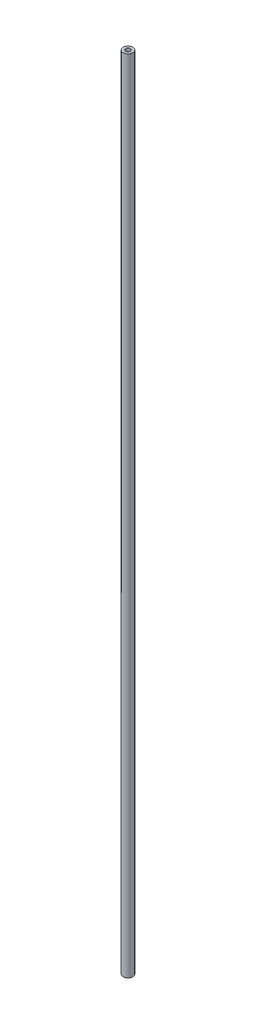
ISO-10303-21;
HEADER;
FILE_DESCRIPTION(('STEP AP214'),'2;1');
FILE_NAME('part.step','',(''),(''),'','','');
FILE_SCHEMA(('AUTOMOTIVE_DESIGN { 1 0 10303 214 1 1 1 1 }'));
ENDSEC;
DATA;
#1=APPLICATION_CONTEXT('core data for automotive mechanical design processes');
#2=APPLICATION_PROTOCOL_DEFINITION('international standard','automotive_design',2000,#1);
#3=PRODUCT_CONTEXT('',#1,'mechanical');
#4=PRODUCT('Part','Part','',(#3));
#5=PRODUCT_RELATED_PRODUCT_CATEGORY('part','',(#4));
#6=PRODUCT_DEFINITION_FORMATION('','',#4);
#7=PRODUCT_DEFINITION_CONTEXT('part definition',#1,'design');
#8=PRODUCT_DEFINITION('design','',#6,#7);
#9=PRODUCT_DEFINITION_SHAPE('','',#8);
#10=(LENGTH_UNIT() NAMED_UNIT(*) SI_UNIT(.MILLI.,.METRE.));
#11=(NAMED_UNIT(*) PLANE_ANGLE_UNIT() SI_UNIT($,.RADIAN.));
#12=(NAMED_UNIT(*) SI_UNIT($,.STERADIAN.) SOLID_ANGLE_UNIT());
#13=UNCERTAINTY_MEASURE_WITH_UNIT(LENGTH_MEASURE(1.E-05),#10,'distance_accuracy_value','');
#14=(GEOMETRIC_REPRESENTATION_CONTEXT(3) GLOBAL_UNCERTAINTY_ASSIGNED_CONTEXT((#13)) GLOBAL_UNIT_ASSIGNED_CONTEXT((#10,
#11,#12)) REPRESENTATION_CONTEXT('',''));
#15=CARTESIAN_POINT('',(0.,0.,0.));
#16=DIRECTION('',(0.,0.,1.));
#17=DIRECTION('',(1.,0.,0.));
#18=AXIS2_PLACEMENT_3D('',#15,#16,#17);
#19=CARTESIAN_POINT('',(0.,499.999999998,0.));
#20=DIRECTION('',(0.,1.,0.));
#21=DIRECTION('',(0.,0.,1.));
#22=AXIS2_PLACEMENT_3D('',#19,#20,#21);
#23=PLANE('',#22);
#24=CARTESIAN_POINT('',(0.,499.999999998,0.));
#25=DIRECTION('',(0.,1.,0.));
#26=DIRECTION('',(0.,0.,1.));
#27=AXIS2_PLACEMENT_3D('',#24,#25,#26);
#28=CIRCLE('',#27,3.);
#29=CARTESIAN_POINT('',(0.,499.999999998,3.));
#30=VERTEX_POINT('',#29);
#31=EDGE_CURVE('E10',#30,#30,#28,.T.);
#32=ORIENTED_EDGE('',*,*,#31,.T.);
#33=EDGE_LOOP('',(#32));
#34=FACE_BOUND('',#33,.T.);
#35=CARTESIAN_POINT('',(0.,499.999999998,0.));
#36=DIRECTION('',(0.,1.,0.));
#37=DIRECTION('',(0.,0.,1.));
#38=AXIS2_PLACEMENT_3D('',#35,#36,#37);
#39=CIRCLE('',#38,1.5);
#40=CARTESIAN_POINT('',(0.,499.999999998,1.5));
#41=VERTEX_POINT('',#40);
#42=EDGE_CURVE('E48',#41,#41,#39,.T.);
#43=ORIENTED_EDGE('',*,*,#42,.F.);
#44=EDGE_LOOP('',(#43));
#45=FACE_BOUND('',#44,.T.);
#46=ADVANCED_FACE('F37',(#34,#45),#23,.T.);
#47=CARTESIAN_POINT('',(0.,0.,0.));
#48=DIRECTION('',(0.,1.,0.));
#49=DIRECTION('',(0.,0.,1.));
#50=AXIS2_PLACEMENT_3D('',#47,#48,#49);
#51=PLANE('',#50);
#52=CARTESIAN_POINT('',(0.,0.,0.));
#53=DIRECTION('',(0.,1.,0.));
#54=DIRECTION('',(0.,0.,1.));
#55=AXIS2_PLACEMENT_3D('',#52,#53,#54);
#56=CIRCLE('',#55,3.);
#57=CARTESIAN_POINT('',(0.,0.,3.));
#58=VERTEX_POINT('',#57);
#59=EDGE_CURVE('E41',#58,#58,#56,.T.);
#60=ORIENTED_EDGE('',*,*,#59,.F.);
#61=EDGE_LOOP('',(#60));
#62=FACE_BOUND('',#61,.T.);
#63=CARTESIAN_POINT('',(0.,0.,0.));
#64=DIRECTION('',(0.,1.,0.));
#65=DIRECTION('',(0.,0.,1.));
#66=AXIS2_PLACEMENT_3D('',#63,#64,#65);
#67=CIRCLE('',#66,1.5);
#68=CARTESIAN_POINT('',(0.,0.,1.5));
#69=VERTEX_POINT('',#68);
#70=EDGE_CURVE('E50',#69,#69,#67,.T.);
#71=ORIENTED_EDGE('',*,*,#70,.T.);
#72=EDGE_LOOP('',(#71));
#73=FACE_BOUND('',#72,.T.);
#74=ADVANCED_FACE('F60',(#62,#73),#51,.F.);
#75=CARTESIAN_POINT('',(0.,499.999999998,0.));
#76=DIRECTION('',(0.,-1.,0.));
#77=DIRECTION('',(0.,0.,-1.));
#78=AXIS2_PLACEMENT_3D('',#75,#76,#77);
#79=CYLINDRICAL_SURFACE('',#78,3.);
#80=ORIENTED_EDGE('',*,*,#31,.F.);
#81=EDGE_LOOP('',(#80));
#82=FACE_BOUND('',#81,.T.);
#83=ORIENTED_EDGE('',*,*,#59,.T.);
#84=EDGE_LOOP('',(#83));
#85=FACE_BOUND('',#84,.T.);
#86=ADVANCED_FACE('F39',(#82,#85),#79,.T.);
#87=CARTESIAN_POINT('',(0.,499.999999998,0.));
#88=DIRECTION('',(0.,-1.,0.));
#89=DIRECTION('',(0.,0.,-1.));
#90=AXIS2_PLACEMENT_3D('',#87,#88,#89);
#91=CYLINDRICAL_SURFACE('',#90,1.5);
#92=ORIENTED_EDGE('',*,*,#42,.T.);
#93=EDGE_LOOP('',(#92));
#94=FACE_BOUND('',#93,.T.);
#95=ORIENTED_EDGE('',*,*,#70,.F.);
#96=EDGE_LOOP('',(#95));
#97=FACE_BOUND('',#96,.T.);
#98=ADVANCED_FACE('F56',(#94,#97),#91,.F.);
#99=CLOSED_SHELL('',(#46,#74,#86,#98));
#100=MANIFOLD_SOLID_BREP('B2',#99);
#101=ADVANCED_BREP_SHAPE_REPRESENTATION('',(#18,#100),#14);
#102=SHAPE_DEFINITION_REPRESENTATION(#9,#101);
ENDSEC;
END-ISO-10303-21;
